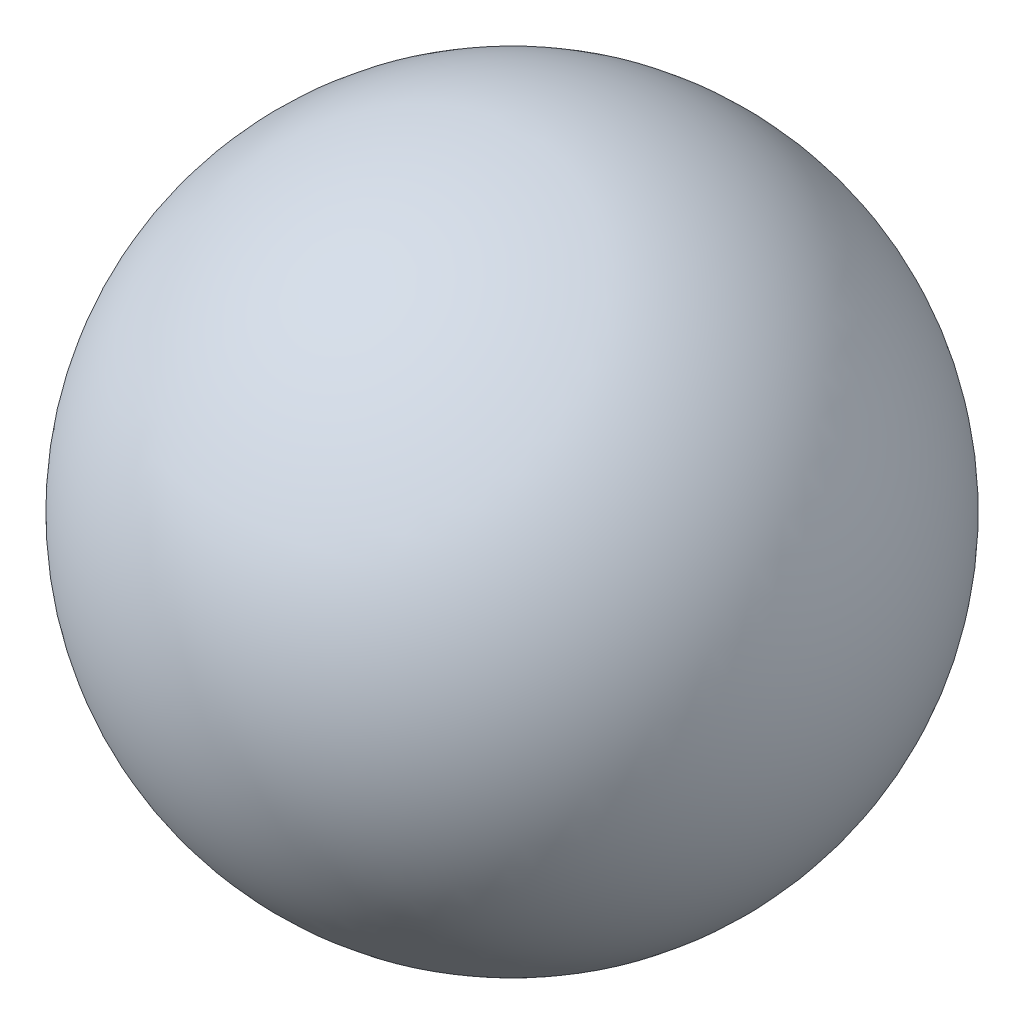
ISO-10303-21;
HEADER;
FILE_DESCRIPTION(('STEP AP214'),'2;1');
FILE_NAME('part.step','',(''),(''),'','','');
FILE_SCHEMA(('AUTOMOTIVE_DESIGN { 1 0 10303 214 1 1 1 1 }'));
ENDSEC;
DATA;
#1=APPLICATION_CONTEXT('core data for automotive mechanical design processes');
#2=APPLICATION_PROTOCOL_DEFINITION('international standard','automotive_design',2000,#1);
#3=PRODUCT_CONTEXT('',#1,'mechanical');
#4=PRODUCT('Part','Part','',(#3));
#5=PRODUCT_RELATED_PRODUCT_CATEGORY('part','',(#4));
#6=PRODUCT_DEFINITION_FORMATION('','',#4);
#7=PRODUCT_DEFINITION_CONTEXT('part definition',#1,'design');
#8=PRODUCT_DEFINITION('design','',#6,#7);
#9=PRODUCT_DEFINITION_SHAPE('','',#8);
#10=(LENGTH_UNIT() NAMED_UNIT(*) SI_UNIT(.MILLI.,.METRE.));
#11=(NAMED_UNIT(*) PLANE_ANGLE_UNIT() SI_UNIT($,.RADIAN.));
#12=(NAMED_UNIT(*) SI_UNIT($,.STERADIAN.) SOLID_ANGLE_UNIT());
#13=UNCERTAINTY_MEASURE_WITH_UNIT(LENGTH_MEASURE(1.E-05),#10,'distance_accuracy_value','');
#14=(GEOMETRIC_REPRESENTATION_CONTEXT(3) GLOBAL_UNCERTAINTY_ASSIGNED_CONTEXT((#13)) GLOBAL_UNIT_ASSIGNED_CONTEXT((#10,
#11,#12)) REPRESENTATION_CONTEXT('',''));
#15=CARTESIAN_POINT('',(0.,0.,0.));
#16=DIRECTION('',(0.,0.,1.));
#17=DIRECTION('',(1.,0.,0.));
#18=AXIS2_PLACEMENT_3D('',#15,#16,#17);
#19=CARTESIAN_POINT('',(0.,0.,0.));
#20=DIRECTION('',(0.,1.,0.));
#21=DIRECTION('',(1.,0.,0.));
#22=AXIS2_PLACEMENT_3D('',#19,#20,#21);
#23=SPHERICAL_SURFACE('',#22,373.);
#24=CARTESIAN_POINT('',(0.,373.,0.));
#25=VERTEX_POINT('',#24);
#26=VERTEX_LOOP('',#25);
#27=FACE_BOUND('',#26,.T.);
#28=ADVANCED_FACE('F33',(#27),#23,.T.);
#29=CLOSED_SHELL('',(#28));
#30=CARTESIAN_POINT('',(0.,0.,0.));
#31=DIRECTION('',(0.,1.,0.));
#32=DIRECTION('',(-1.,0.,0.));
#33=AXIS2_PLACEMENT_3D('',#30,#31,#32);
#34=SPHERICAL_SURFACE('',#33,370.);
#35=CARTESIAN_POINT('',(0.,370.,0.));
#36=VERTEX_POINT('',#35);
#37=VERTEX_LOOP('',#36);
#38=FACE_BOUND('',#37,.T.);
#39=ADVANCED_FACE('F45',(#38),#34,.F.);
#40=CLOSED_SHELL('',(#39));
#41=ORIENTED_CLOSED_SHELL('',*,#40,.T.);
#42=BREP_WITH_VOIDS('B2',#29,(#41));
#43=ADVANCED_BREP_SHAPE_REPRESENTATION('',(#18,#42),#14);
#44=SHAPE_DEFINITION_REPRESENTATION(#9,#43);
ENDSEC;
END-ISO-10303-21;
